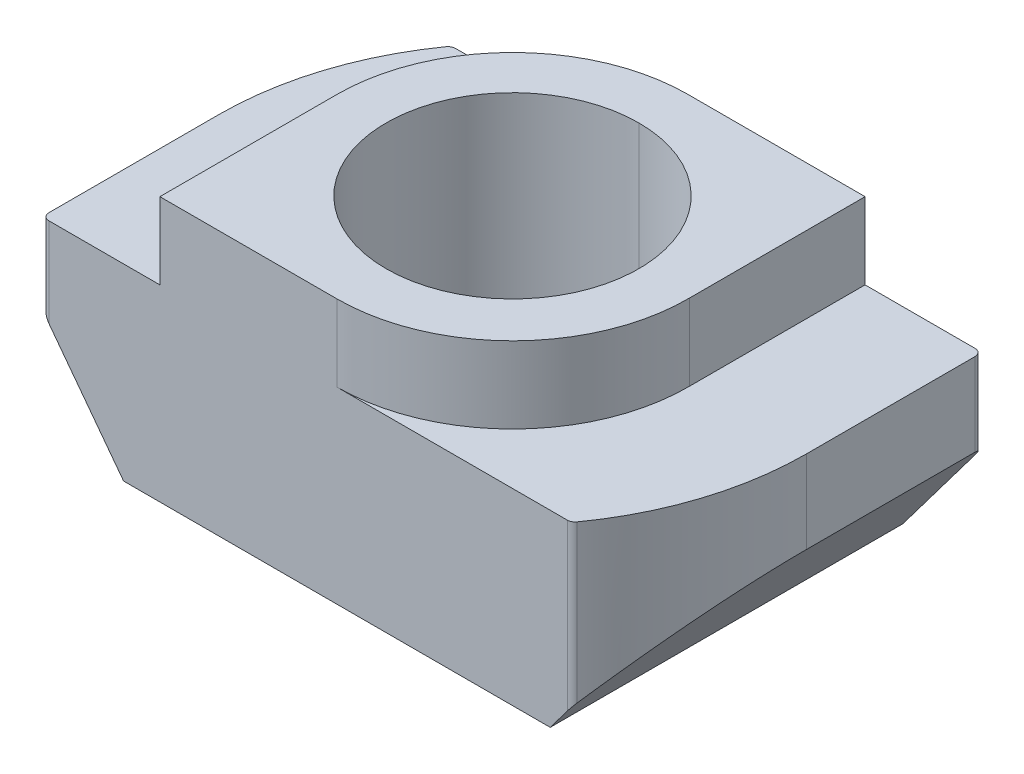
ISO-10303-21;
HEADER;
FILE_DESCRIPTION(('STEP AP214'),'2;1');
FILE_NAME('part.step','',(''),(''),'','','');
FILE_SCHEMA(('AUTOMOTIVE_DESIGN { 1 0 10303 214 1 1 1 1 }'));
ENDSEC;
DATA;
#1=APPLICATION_CONTEXT('core data for automotive mechanical design processes');
#2=APPLICATION_PROTOCOL_DEFINITION('international standard','automotive_design',2000,#1);
#3=PRODUCT_CONTEXT('',#1,'mechanical');
#4=PRODUCT('Part','Part','',(#3));
#5=PRODUCT_RELATED_PRODUCT_CATEGORY('part','',(#4));
#6=PRODUCT_DEFINITION_FORMATION('','',#4);
#7=PRODUCT_DEFINITION_CONTEXT('part definition',#1,'design');
#8=PRODUCT_DEFINITION('design','',#6,#7);
#9=PRODUCT_DEFINITION_SHAPE('','',#8);
#10=(LENGTH_UNIT() NAMED_UNIT(*) SI_UNIT(.MILLI.,.METRE.));
#11=(NAMED_UNIT(*) PLANE_ANGLE_UNIT() SI_UNIT($,.RADIAN.));
#12=(NAMED_UNIT(*) SI_UNIT($,.STERADIAN.) SOLID_ANGLE_UNIT());
#13=UNCERTAINTY_MEASURE_WITH_UNIT(LENGTH_MEASURE(1.E-05),#10,'distance_accuracy_value','');
#14=(GEOMETRIC_REPRESENTATION_CONTEXT(3) GLOBAL_UNCERTAINTY_ASSIGNED_CONTEXT((#13)) GLOBAL_UNIT_ASSIGNED_CONTEXT((#10,
#11,#12)) REPRESENTATION_CONTEXT('',''));
#15=CARTESIAN_POINT('',(0.,0.,0.));
#16=DIRECTION('',(0.,0.,1.));
#17=DIRECTION('',(1.,0.,0.));
#18=AXIS2_PLACEMENT_3D('',#15,#16,#17);
#19=CARTESIAN_POINT('',(-0.024551835244514,-0.00100000000000013,0.));
#20=DIRECTION('',(0.,1.,0.));
#21=DIRECTION('',(0.,0.,1.));
#22=AXIS2_PLACEMENT_3D('',#19,#20,#21);
#23=CYLINDRICAL_SURFACE('',#22,2.15);
#24=DIRECTION('',(0.,1.,0.));
#25=VECTOR('',#24,1.);
#26=CARTESIAN_POINT('',(-0.0245518352445138,-0.00100000000000013,-2.15));
#27=LINE('',#26,#25);
#28=CARTESIAN_POINT('',(-0.0245518352445138,0.,-2.15));
#29=VERTEX_POINT('',#28);
#30=CARTESIAN_POINT('',(-0.0245518352445138,4.5,-2.15));
#31=VERTEX_POINT('',#30);
#32=EDGE_CURVE('E527',#29,#31,#27,.T.);
#33=ORIENTED_EDGE('',*,*,#32,.F.);
#34=CARTESIAN_POINT('',(-0.024551835244514,0.,0.));
#35=DIRECTION('',(0.,1.,0.));
#36=DIRECTION('',(0.,0.,-1.));
#37=AXIS2_PLACEMENT_3D('',#34,#35,#36);
#38=CIRCLE('',#37,2.15);
#39=CARTESIAN_POINT('',(-0.024551835244514,0.,2.15));
#40=VERTEX_POINT('',#39);
#41=EDGE_CURVE('E125',#40,#29,#38,.T.);
#42=ORIENTED_EDGE('',*,*,#41,.F.);
#43=DIRECTION('',(0.,1.,0.));
#44=VECTOR('',#43,1.);
#45=CARTESIAN_POINT('',(-0.024551835244514,-0.00100000000000013,2.15));
#46=LINE('',#45,#44);
#47=CARTESIAN_POINT('',(-0.024551835244514,4.5,2.15));
#48=VERTEX_POINT('',#47);
#49=EDGE_CURVE('E470',#40,#48,#46,.T.);
#50=ORIENTED_EDGE('',*,*,#49,.T.);
#51=CARTESIAN_POINT('',(-0.024551835244514,4.5,0.));
#52=DIRECTION('',(0.,1.,0.));
#53=DIRECTION('',(0.,0.,1.));
#54=AXIS2_PLACEMENT_3D('',#51,#52,#53);
#55=CIRCLE('',#54,2.15);
#56=EDGE_CURVE('E9',#48,#31,#55,.T.);
#57=ORIENTED_EDGE('',*,*,#56,.T.);
#58=EDGE_LOOP('',(#33,#42,#50,#57));
#59=FACE_BOUND('',#58,.T.);
#60=ADVANCED_FACE('F15',(#59),#23,.F.);
#61=CARTESIAN_POINT('',(3.63,0.,-4.65));
#62=DIRECTION('',(-0.79863551004729,0.601815023152053,0.));
#63=DIRECTION('',(0.,0.,1.));
#64=AXIS2_PLACEMENT_3D('',#61,#62,#63);
#65=PLANE('',#64);
#66=DIRECTION('',(0.,0.,-1.));
#67=VECTOR('',#66,1.);
#68=CARTESIAN_POINT('',(3.63,0.,-2.85267364326446));
#69=LINE('',#68,#67);
#70=CARTESIAN_POINT('',(3.63,0.,3.01232635673554));
#71=VERTEX_POINT('',#70);
#72=CARTESIAN_POINT('',(3.63,0.,-2.98767364326446));
#73=VERTEX_POINT('',#72);
#74=EDGE_CURVE('E272',#71,#73,#69,.T.);
#75=ORIENTED_EDGE('',*,*,#74,.T.);
#76=DIRECTION('',(-0.601815023152053,-0.79863551004729,0.));
#77=VECTOR('',#76,1.);
#78=CARTESIAN_POINT('',(5.61330473915061,2.63193428378501,-2.98767364326446));
#79=LINE('',#78,#77);
#80=CARTESIAN_POINT('',(4.85945607210742,1.63154331389991,-2.98767364326446));
#81=VERTEX_POINT('',#80);
#82=EDGE_CURVE('E498',#81,#73,#79,.T.);
#83=ORIENTED_EDGE('',*,*,#82,.F.);
#84=CARTESIAN_POINT('',(4.97945607210742,1.79078869249436,-2.86767364326445));
#85=CARTESIAN_POINT('',(4.97945607210742,1.79078869249435,-2.93796801577968));
#86=CARTESIAN_POINT('',(4.92975044462265,1.72482709693529,-2.98767364326445));
#87=CARTESIAN_POINT('',(4.85945607210742,1.63154331389991,-2.98767364326446));
#88=(BOUNDED_CURVE() B_SPLINE_CURVE(3,(#84,#85,#86,#87),.UNSPECIFIED.,.F.,
.F.) B_SPLINE_CURVE_WITH_KNOTS((4,4),(3.14159265358979,4.7123889803847),
.UNSPECIFIED.) CURVE() GEOMETRIC_REPRESENTATION_ITEM() RATIONAL_B_SPLINE_CURVE((1.,
0.804737854124362,0.804737854124362,1.)) REPRESENTATION_ITEM(''));
#89=CARTESIAN_POINT('',(4.97945607210742,1.79078869249436,-2.86767364326445));
#90=VERTEX_POINT('',#89);
#91=EDGE_CURVE('E499',#90,#81,#88,.T.);
#92=ORIENTED_EDGE('',*,*,#91,.F.);
#93=DIRECTION('',(0.,0.,-1.));
#94=VECTOR('',#93,1.);
#95=CARTESIAN_POINT('',(4.97945607210742,1.79078869249435,0.));
#96=LINE('',#95,#94);
#97=CARTESIAN_POINT('',(4.97945607210742,1.79078869249435,0.));
#98=VERTEX_POINT('',#97);
#99=EDGE_CURVE('E447',#98,#90,#96,.T.);
#100=ORIENTED_EDGE('',*,*,#99,.F.);
#101=CARTESIAN_POINT('',(4.02973652434524,0.530468284644888,2.9559577450269));
#102=CARTESIAN_POINT('',(4.65243275016336,1.35681408655938,2.08693430503643));
#103=CARTESIAN_POINT('',(4.97945607210742,1.79078869249435,1.06908948591827));
#104=CARTESIAN_POINT('',(4.97945607210742,1.79078869249435,0.));
#105=(BOUNDED_CURVE() B_SPLINE_CURVE(3,(#101,#102,#103,#104),.UNSPECIFIED.,.F.,
.F.) B_SPLINE_CURVE_WITH_KNOTS((4,4),(2.51984736449592,3.1415926535898),
.UNSPECIFIED.) CURVE() GEOMETRIC_REPRESENTATION_ITEM() RATIONAL_B_SPLINE_CURVE((1.,
0.968044666372586,0.968044666372586,1.)) REPRESENTATION_ITEM(''));
#106=CARTESIAN_POINT('',(4.02973652434524,0.530468284644888,2.9559577450269));
#107=VERTEX_POINT('',#106);
#108=EDGE_CURVE('E271',#107,#98,#105,.T.);
#109=ORIENTED_EDGE('',*,*,#108,.F.);
#110=CARTESIAN_POINT('',(3.92,0.384842998269915,3.01232635673554));
#111=CARTESIAN_POINT('',(3.96439243811548,0.443753753390169,3.01232635673554));
#112=CARTESIAN_POINT('',(4.0038799388737,0.496155436790089,2.99204272181212));
#113=CARTESIAN_POINT('',(4.02973652434524,0.530468284644888,2.9559577450269));
#114=(BOUNDED_CURVE() B_SPLINE_CURVE(3,(#110,#111,#112,#113),.UNSPECIFIED.,.F.,
.F.) B_SPLINE_CURVE_WITH_KNOTS((4,4),(1.5707963267949,2.51984736449592),
.UNSPECIFIED.) CURVE() GEOMETRIC_REPRESENTATION_ITEM() RATIONAL_B_SPLINE_CURVE((1.,
0.926339746655243,0.926339746655243,1.)) REPRESENTATION_ITEM(''));
#115=CARTESIAN_POINT('',(3.92,0.384842998269915,3.01232635673554));
#116=VERTEX_POINT('',#115);
#117=EDGE_CURVE('E238',#116,#107,#114,.T.);
#118=ORIENTED_EDGE('',*,*,#117,.F.);
#119=DIRECTION('',(0.601815023152053,0.79863551004729,0.));
#120=VECTOR('',#119,1.);
#121=CARTESIAN_POINT('',(5.27305129690785,2.18040271521824,3.01232635673554));
#122=LINE('',#121,#120);
#123=EDGE_CURVE('E506',#71,#116,#122,.T.);
#124=ORIENTED_EDGE('',*,*,#123,.F.);
#125=EDGE_LOOP('',(#75,#83,#92,#100,#109,#118,#124));
#126=FACE_BOUND('',#125,.T.);
#127=ADVANCED_FACE('F17',(#126),#65,.F.);
#128=CARTESIAN_POINT('',(-3.63,0.,-4.65));
#129=DIRECTION('',(0.79863551004729,0.601815023152053,0.));
#130=DIRECTION('',(0.,0.,-1.));
#131=AXIS2_PLACEMENT_3D('',#128,#129,#130);
#132=PLANE('',#131);
#133=DIRECTION('',(0.,0.,1.));
#134=VECTOR('',#133,1.);
#135=CARTESIAN_POINT('',(-5.02054392789258,1.84531411874553,-4.65));
#136=LINE('',#135,#134);
#137=CARTESIAN_POINT('',(-5.02054392789258,1.84531411874553,0.));
#138=VERTEX_POINT('',#137);
#139=CARTESIAN_POINT('',(-5.02054392789258,1.84531411874553,2.89232635673554));
#140=VERTEX_POINT('',#139);
#141=EDGE_CURVE('E261',#138,#140,#136,.T.);
#142=ORIENTED_EDGE('',*,*,#141,.F.);
#143=CARTESIAN_POINT('',(-4.08885480736663,0.608920895991516,-2.930631323799));
#144=CARTESIAN_POINT('',(-4.69993502645744,1.41985173633062,-2.06668938083629));
#145=CARTESIAN_POINT('',(-5.02054392789258,1.84531411874553,-1.05821298185869));
#146=CARTESIAN_POINT('',(-5.02054392789258,1.84531411874553,0.));
#147=(BOUNDED_CURVE() B_SPLINE_CURVE(3,(#143,#144,#145,#146),.UNSPECIFIED.,.F.,
.F.) B_SPLINE_CURVE_WITH_KNOTS((4,4),(2.52597327905867,3.1415926535898),
.UNSPECIFIED.) CURVE() GEOMETRIC_REPRESENTATION_ITEM() RATIONAL_B_SPLINE_CURVE((1.,
0.968666305848477,0.968666305848477,1.)) REPRESENTATION_ITEM(''));
#148=CARTESIAN_POINT('',(-4.08885480736663,0.608920895991516,-2.930631323799));
#149=VERTEX_POINT('',#148);
#150=EDGE_CURVE('E484',#149,#138,#147,.T.);
#151=ORIENTED_EDGE('',*,*,#150,.F.);
#152=CARTESIAN_POINT('',(-3.97863865589294,0.462659122919423,-2.98767364326446));
#153=CARTESIAN_POINT('',(-4.02334074952601,0.52198080479078,-2.98767364326445));
#154=CARTESIAN_POINT('',(-4.06304094414684,0.574664742479666,-2.96712682545126));
#155=CARTESIAN_POINT('',(-4.08885480736663,0.608920895991516,-2.930631323799));
#156=(BOUNDED_CURVE() B_SPLINE_CURVE(3,(#152,#153,#154,#155),.UNSPECIFIED.,.F.,
.F.) B_SPLINE_CURVE_WITH_KNOTS((4,4),(1.5707963267949,2.52597327905868),
.UNSPECIFIED.) CURVE() GEOMETRIC_REPRESENTATION_ITEM() RATIONAL_B_SPLINE_CURVE((1.,
0.925403956045779,0.925403956045779,1.)) REPRESENTATION_ITEM(''));
#157=CARTESIAN_POINT('',(-3.97863865589294,0.462659122919423,-2.98767364326446));
#158=VERTEX_POINT('',#157);
#159=EDGE_CURVE('E290',#158,#149,#156,.T.);
#160=ORIENTED_EDGE('',*,*,#159,.F.);
#161=DIRECTION('',(-0.601815023152053,0.79863551004729,0.));
#162=VECTOR('',#161,1.);
#163=CARTESIAN_POINT('',(-2.09329628946769,-2.03927470142675,-2.98767364326446));
#164=LINE('',#163,#162);
#165=CARTESIAN_POINT('',(-3.63,0.,-2.98767364326446));
#166=VERTEX_POINT('',#165);
#167=EDGE_CURVE('E520',#166,#158,#164,.T.);
#168=ORIENTED_EDGE('',*,*,#167,.F.);
#169=DIRECTION('',(0.,0.,1.));
#170=VECTOR('',#169,1.);
#171=CARTESIAN_POINT('',(-3.63,0.,-2.85267364326446));
#172=LINE('',#171,#170);
#173=CARTESIAN_POINT('',(-3.63,0.,3.01232635673554));
#174=VERTEX_POINT('',#173);
#175=EDGE_CURVE('E233',#166,#174,#172,.T.);
#176=ORIENTED_EDGE('',*,*,#175,.T.);
#177=DIRECTION('',(0.601815023152053,-0.79863551004729,0.));
#178=VECTOR('',#177,1.);
#179=CARTESIAN_POINT('',(-2.43354973171045,-1.58774313285998,3.01232635673554));
#180=LINE('',#179,#178);
#181=CARTESIAN_POINT('',(-4.90054392789258,1.68606874015109,3.01232635673554));
#182=VERTEX_POINT('',#181);
#183=EDGE_CURVE('E229',#182,#174,#180,.T.);
#184=ORIENTED_EDGE('',*,*,#183,.F.);
#185=CARTESIAN_POINT('',(-5.02054392789258,1.84531411874553,2.89232635673554));
#186=CARTESIAN_POINT('',(-5.02054392789258,1.84531411874553,2.96262072925078));
#187=CARTESIAN_POINT('',(-4.97083830040781,1.77935252318647,3.01232635673555));
#188=CARTESIAN_POINT('',(-4.90054392789258,1.68606874015109,3.01232635673554));
#189=(BOUNDED_CURVE() B_SPLINE_CURVE(3,(#185,#186,#187,#188),.UNSPECIFIED.,.F.,
.F.) B_SPLINE_CURVE_WITH_KNOTS((4,4),(3.1415926535898,4.71238898038469),
.UNSPECIFIED.) CURVE() GEOMETRIC_REPRESENTATION_ITEM() RATIONAL_B_SPLINE_CURVE((1.,
0.804737854124365,0.804737854124365,1.)) REPRESENTATION_ITEM(''));
#190=EDGE_CURVE('E224',#140,#182,#189,.T.);
#191=ORIENTED_EDGE('',*,*,#190,.F.);
#192=EDGE_LOOP('',(#142,#151,#160,#168,#176,#184,#191));
#193=FACE_BOUND('',#192,.T.);
#194=ADVANCED_FACE('F231',(#193),#132,.F.);
#195=CARTESIAN_POINT('',(0.,4.5,0.0245518352445135));
#196=DIRECTION('',(0.,1.,0.));
#197=DIRECTION('',(1.,0.,0.));
#198=AXIS2_PLACEMENT_3D('',#195,#196,#197);
#199=PLANE('',#198);
#200=ORIENTED_EDGE('',*,*,#56,.F.);
#201=CARTESIAN_POINT('',(-0.024551835244514,4.5,0.));
#202=DIRECTION('',(0.,1.,0.));
#203=DIRECTION('',(0.,0.,1.));
#204=AXIS2_PLACEMENT_3D('',#201,#202,#203);
#205=CIRCLE('',#204,2.15);
#206=EDGE_CURVE('E523',#31,#48,#205,.T.);
#207=ORIENTED_EDGE('',*,*,#206,.F.);
#208=EDGE_LOOP('',(#200,#207));
#209=FACE_BOUND('',#208,.T.);
#210=CARTESIAN_POINT('',(0.,4.5,0.0245518352445135));
#211=DIRECTION('',(0.,1.,0.));
#212=DIRECTION('',(0.,0.,1.));
#213=AXIS2_PLACEMENT_3D('',#210,#211,#212);
#214=CIRCLE('',#213,2.98777452149104);
#215=CARTESIAN_POINT('',(0.,4.5,3.01232635673554));
#216=VERTEX_POINT('',#215);
#217=CARTESIAN_POINT('',(2.98767364326446,4.5,0.));
#218=VERTEX_POINT('',#217);
#219=EDGE_CURVE('E608',#216,#218,#214,.T.);
#220=ORIENTED_EDGE('',*,*,#219,.T.);
#221=DIRECTION('',(0.,0.,-1.));
#222=VECTOR('',#221,1.);
#223=CARTESIAN_POINT('',(2.98767364326446,4.5,0.));
#224=LINE('',#223,#222);
#225=CARTESIAN_POINT('',(2.98767364326446,4.5,-2.98767364326446));
#226=VERTEX_POINT('',#225);
#227=EDGE_CURVE('E41',#218,#226,#224,.T.);
#228=ORIENTED_EDGE('',*,*,#227,.T.);
#229=DIRECTION('',(-1.,0.,0.));
#230=VECTOR('',#229,1.);
#231=CARTESIAN_POINT('',(2.98767364326446,4.5,-2.98767364326446));
#232=LINE('',#231,#230);
#233=CARTESIAN_POINT('',(0.,4.5,-2.98767364326446));
#234=VERTEX_POINT('',#233);
#235=EDGE_CURVE('E577',#226,#234,#232,.T.);
#236=ORIENTED_EDGE('',*,*,#235,.T.);
#237=CARTESIAN_POINT('',(-0.024551835244514,4.5,0.));
#238=DIRECTION('',(0.,1.,0.));
#239=DIRECTION('',(0.,0.,-1.));
#240=AXIS2_PLACEMENT_3D('',#237,#238,#239);
#241=CIRCLE('',#240,2.98777452149103);
#242=CARTESIAN_POINT('',(-0.024551835244514,4.5,-2.98777452149103));
#243=VERTEX_POINT('',#242);
#244=EDGE_CURVE('E303',#234,#243,#241,.T.);
#245=ORIENTED_EDGE('',*,*,#244,.T.);
#246=CARTESIAN_POINT('',(-0.024551835244514,4.5,0.));
#247=DIRECTION('',(0.,1.,0.));
#248=DIRECTION('',(0.,0.,-1.));
#249=AXIS2_PLACEMENT_3D('',#246,#247,#248);
#250=CIRCLE('',#249,2.98777452149103);
#251=CARTESIAN_POINT('',(-3.01232635673554,4.5,0.));
#252=VERTEX_POINT('',#251);
#253=EDGE_CURVE('E309',#243,#252,#250,.T.);
#254=ORIENTED_EDGE('',*,*,#253,.T.);
#255=DIRECTION('',(0.,0.,1.));
#256=VECTOR('',#255,1.);
#257=CARTESIAN_POINT('',(-3.01232635673554,4.5,3.01232635673555));
#258=LINE('',#257,#256);
#259=CARTESIAN_POINT('',(-3.01232635673554,4.5,3.01232635673555));
#260=VERTEX_POINT('',#259);
#261=EDGE_CURVE('E26',#252,#260,#258,.T.);
#262=ORIENTED_EDGE('',*,*,#261,.T.);
#263=DIRECTION('',(1.,0.,0.));
#264=VECTOR('',#263,1.);
#265=CARTESIAN_POINT('',(0.,4.5,3.01232635673554));
#266=LINE('',#265,#264);
#267=EDGE_CURVE('E576',#260,#216,#266,.T.);
#268=ORIENTED_EDGE('',*,*,#267,.T.);
#269=EDGE_LOOP('',(#220,#228,#236,#245,#254,#262,#268));
#270=FACE_BOUND('',#269,.T.);
#271=ADVANCED_FACE('F337',(#209,#270),#199,.T.);
#272=CARTESIAN_POINT('',(-3.01232635673554,4.5,3.01232635673555));
#273=DIRECTION('',(1.,0.,0.));
#274=DIRECTION('',(0.,1.,0.));
#275=AXIS2_PLACEMENT_3D('',#272,#273,#274);
#276=PLANE('',#275);
#277=DIRECTION('',(0.,0.,1.));
#278=VECTOR('',#277,1.);
#279=CARTESIAN_POINT('',(-3.01232635673554,3.2,3.01232635673555));
#280=LINE('',#279,#278);
#281=CARTESIAN_POINT('',(-3.01232635673554,3.2,0.));
#282=VERTEX_POINT('',#281);
#283=CARTESIAN_POINT('',(-3.01232635673554,3.2,3.01232635673554));
#284=VERTEX_POINT('',#283);
#285=EDGE_CURVE('E395',#282,#284,#280,.T.);
#286=ORIENTED_EDGE('',*,*,#285,.T.);
#287=DIRECTION('',(0.,-1.,0.));
#288=VECTOR('',#287,1.);
#289=CARTESIAN_POINT('',(-3.01232635673554,4.5,3.01232635673555));
#290=LINE('',#289,#288);
#291=EDGE_CURVE('E239',#260,#284,#290,.T.);
#292=ORIENTED_EDGE('',*,*,#291,.F.);
#293=ORIENTED_EDGE('',*,*,#261,.F.);
#294=DIRECTION('',(0.,-1.,0.));
#295=VECTOR('',#294,1.);
#296=CARTESIAN_POINT('',(-3.01232635673554,4.5,0.));
#297=LINE('',#296,#295);
#298=EDGE_CURVE('E400',#252,#282,#297,.T.);
#299=ORIENTED_EDGE('',*,*,#298,.T.);
#300=EDGE_LOOP('',(#286,#292,#293,#299));
#301=FACE_BOUND('',#300,.T.);
#302=ADVANCED_FACE('F335',(#301),#276,.F.);
#303=CARTESIAN_POINT('',(-0.024551835244514,4.5,0.));
#304=DIRECTION('',(0.,-1.,0.));
#305=DIRECTION('',(0.,0.,-1.));
#306=AXIS2_PLACEMENT_3D('',#303,#304,#305);
#307=CYLINDRICAL_SURFACE('',#306,2.98777452149103);
#308=DIRECTION('',(0.,-1.,0.));
#309=VECTOR('',#308,1.);
#310=CARTESIAN_POINT('',(-0.024551835244514,4.5,-2.98777452149103));
#311=LINE('',#310,#309);
#312=CARTESIAN_POINT('',(-0.0245518352445137,3.2,-2.98772408237775));
#313=VERTEX_POINT('',#312);
#314=EDGE_CURVE('E304',#243,#313,#311,.T.);
#315=ORIENTED_EDGE('',*,*,#314,.F.);
#316=ORIENTED_EDGE('',*,*,#244,.F.);
#317=DIRECTION('',(0.,-1.,0.));
#318=VECTOR('',#317,1.);
#319=CARTESIAN_POINT('',(0.,4.5,-2.98767364326446));
#320=LINE('',#319,#318);
#321=CARTESIAN_POINT('',(0.,3.2,-2.98767364326446));
#322=VERTEX_POINT('',#321);
#323=EDGE_CURVE('E581',#234,#322,#320,.T.);
#324=ORIENTED_EDGE('',*,*,#323,.T.);
#325=CARTESIAN_POINT('',(-0.024551835244514,3.2,0.));
#326=DIRECTION('',(0.,1.,0.));
#327=DIRECTION('',(0.00821743242933786,0.,-0.999966236332142));
#328=AXIS2_PLACEMENT_3D('',#325,#326,#327);
#329=CIRCLE('',#328,2.98777452149103);
#330=EDGE_CURVE('E317',#322,#313,#329,.T.);
#331=ORIENTED_EDGE('',*,*,#330,.T.);
#332=EDGE_LOOP('',(#315,#316,#324,#331));
#333=FACE_BOUND('',#332,.T.);
#334=ADVANCED_FACE('F324',(#333),#307,.T.);
#335=CARTESIAN_POINT('',(2.98767364326446,4.5,0.));
#336=DIRECTION('',(-1.,0.,0.));
#337=DIRECTION('',(0.,0.,1.));
#338=AXIS2_PLACEMENT_3D('',#335,#336,#337);
#339=PLANE('',#338);
#340=DIRECTION('',(0.,0.,-1.));
#341=VECTOR('',#340,1.);
#342=CARTESIAN_POINT('',(2.98767364326446,3.2,0.));
#343=LINE('',#342,#341);
#344=CARTESIAN_POINT('',(2.98767364326446,3.2,0.));
#345=VERTEX_POINT('',#344);
#346=CARTESIAN_POINT('',(2.98767364326446,3.2,-2.98767364326446));
#347=VERTEX_POINT('',#346);
#348=EDGE_CURVE('E474',#345,#347,#343,.T.);
#349=ORIENTED_EDGE('',*,*,#348,.T.);
#350=DIRECTION('',(0.,-1.,0.));
#351=VECTOR('',#350,1.);
#352=CARTESIAN_POINT('',(2.98767364326446,4.5,-2.98767364326446));
#353=LINE('',#352,#351);
#354=EDGE_CURVE('E275',#226,#347,#353,.T.);
#355=ORIENTED_EDGE('',*,*,#354,.F.);
#356=ORIENTED_EDGE('',*,*,#227,.F.);
#357=DIRECTION('',(0.,-1.,0.));
#358=VECTOR('',#357,1.);
#359=CARTESIAN_POINT('',(2.98767364326446,4.5,0.));
#360=LINE('',#359,#358);
#361=EDGE_CURVE('E610',#218,#345,#360,.T.);
#362=ORIENTED_EDGE('',*,*,#361,.T.);
#363=EDGE_LOOP('',(#349,#355,#356,#362));
#364=FACE_BOUND('',#363,.T.);
#365=ADVANCED_FACE('F334',(#364),#339,.F.);
#366=CARTESIAN_POINT('',(0.,4.5,0.0245518352445135));
#367=DIRECTION('',(0.,-1.,0.));
#368=DIRECTION('',(0.,0.,-1.));
#369=AXIS2_PLACEMENT_3D('',#366,#367,#368);
#370=CYLINDRICAL_SURFACE('',#369,2.98777452149104);
#371=CARTESIAN_POINT('',(0.,3.2,0.0245518352445135));
#372=DIRECTION('',(0.,1.,0.));
#373=DIRECTION('',(0.,0.,1.));
#374=AXIS2_PLACEMENT_3D('',#371,#372,#373);
#375=CIRCLE('',#374,2.98777452149104);
#376=CARTESIAN_POINT('',(0.,3.2,3.01232635673554));
#377=VERTEX_POINT('',#376);
#378=EDGE_CURVE('E530',#377,#345,#375,.T.);
#379=ORIENTED_EDGE('',*,*,#378,.T.);
#380=ORIENTED_EDGE('',*,*,#361,.F.);
#381=ORIENTED_EDGE('',*,*,#219,.F.);
#382=DIRECTION('',(0.,-1.,0.));
#383=VECTOR('',#382,1.);
#384=CARTESIAN_POINT('',(0.,4.5,3.01232635673554));
#385=LINE('',#384,#383);
#386=EDGE_CURVE('E573',#216,#377,#385,.T.);
#387=ORIENTED_EDGE('',*,*,#386,.T.);
#388=EDGE_LOOP('',(#379,#380,#381,#387));
#389=FACE_BOUND('',#388,.T.);
#390=ADVANCED_FACE('F350',(#389),#370,.T.);
#391=CARTESIAN_POINT('',(-3.97863865589294,0.,-2.85267364326446));
#392=DIRECTION('',(0.,-1.,0.));
#393=DIRECTION('',(0.,0.,-1.));
#394=AXIS2_PLACEMENT_3D('',#391,#392,#393);
#395=PLANE('',#394);
#396=ORIENTED_EDGE('',*,*,#41,.T.);
#397=CARTESIAN_POINT('',(-0.024551835244514,0.,0.));
#398=DIRECTION('',(0.,1.,0.));
#399=DIRECTION('',(0.,0.,-1.));
#400=AXIS2_PLACEMENT_3D('',#397,#398,#399);
#401=CIRCLE('',#400,2.15);
#402=EDGE_CURVE('E540',#29,#40,#401,.T.);
#403=ORIENTED_EDGE('',*,*,#402,.T.);
#404=EDGE_LOOP('',(#396,#403));
#405=FACE_BOUND('',#404,.T.);
#406=ORIENTED_EDGE('',*,*,#74,.F.);
#407=DIRECTION('',(1.,0.,0.));
#408=VECTOR('',#407,1.);
#409=CARTESIAN_POINT('',(3.92,0.,3.01232635673554));
#410=LINE('',#409,#408);
#411=EDGE_CURVE('E250',#174,#71,#410,.T.);
#412=ORIENTED_EDGE('',*,*,#411,.F.);
#413=ORIENTED_EDGE('',*,*,#175,.F.);
#414=DIRECTION('',(-1.,0.,0.));
#415=VECTOR('',#414,1.);
#416=CARTESIAN_POINT('',(4.85945607210742,0.,-2.98767364326446));
#417=LINE('',#416,#415);
#418=EDGE_CURVE('E516',#73,#166,#417,.T.);
#419=ORIENTED_EDGE('',*,*,#418,.F.);
#420=EDGE_LOOP('',(#406,#412,#413,#419));
#421=FACE_BOUND('',#420,.T.);
#422=ADVANCED_FACE('F353',(#405,#421),#395,.T.);
#423=CARTESIAN_POINT('',(4.85945607210742,3.2,-2.98767364326446));
#424=DIRECTION('',(0.,0.,1.));
#425=DIRECTION('',(1.,0.,0.));
#426=AXIS2_PLACEMENT_3D('',#423,#424,#425);
#427=PLANE('',#426);
#428=DIRECTION('',(0.,-1.,0.));
#429=VECTOR('',#428,1.);
#430=CARTESIAN_POINT('',(4.85945607210742,3.2,-2.98767364326446));
#431=LINE('',#430,#429);
#432=CARTESIAN_POINT('',(4.85945607210742,3.2,-2.98767364326446));
#433=VERTEX_POINT('',#432);
#434=EDGE_CURVE('E491',#433,#81,#431,.T.);
#435=ORIENTED_EDGE('',*,*,#434,.T.);
#436=ORIENTED_EDGE('',*,*,#82,.T.);
#437=ORIENTED_EDGE('',*,*,#418,.T.);
#438=ORIENTED_EDGE('',*,*,#167,.T.);
#439=DIRECTION('',(0.,-1.,0.));
#440=VECTOR('',#439,1.);
#441=CARTESIAN_POINT('',(-3.97863865589294,3.2,-2.98767364326446));
#442=LINE('',#441,#440);
#443=CARTESIAN_POINT('',(-3.97863865589294,3.2,-2.98767364326446));
#444=VERTEX_POINT('',#443);
#445=EDGE_CURVE('E297',#444,#158,#442,.T.);
#446=ORIENTED_EDGE('',*,*,#445,.F.);
#447=DIRECTION('',(-1.,0.,0.));
#448=VECTOR('',#447,1.);
#449=CARTESIAN_POINT('',(4.85945607210742,3.2,-2.98767364326446));
#450=LINE('',#449,#448);
#451=CARTESIAN_POINT('',(-0.0491036704889641,3.2,-2.98767364326446));
#452=VERTEX_POINT('',#451);
#453=EDGE_CURVE('E289',#452,#444,#450,.T.);
#454=ORIENTED_EDGE('',*,*,#453,.F.);
#455=CARTESIAN_POINT('',(-0.024551835244514,3.2,0.));
#456=DIRECTION('',(0.,1.,0.));
#457=DIRECTION('',(0.,0.,-1.));
#458=AXIS2_PLACEMENT_3D('',#455,#456,#457);
#459=CIRCLE('',#458,2.98777452149103);
#460=EDGE_CURVE('E308',#313,#452,#459,.T.);
#461=ORIENTED_EDGE('',*,*,#460,.F.);
#462=ORIENTED_EDGE('',*,*,#330,.F.);
#463=ORIENTED_EDGE('',*,*,#323,.F.);
#464=ORIENTED_EDGE('',*,*,#235,.F.);
#465=ORIENTED_EDGE('',*,*,#354,.T.);
#466=DIRECTION('',(-1.,0.,0.));
#467=VECTOR('',#466,1.);
#468=CARTESIAN_POINT('',(4.85945607210742,3.2,-2.98767364326446));
#469=LINE('',#468,#467);
#470=EDGE_CURVE('E280',#433,#347,#469,.T.);
#471=ORIENTED_EDGE('',*,*,#470,.F.);
#472=EDGE_LOOP('',(#435,#436,#437,#438,#446,#454,#461,#462,#463,#464,#465,#471));
#473=FACE_BOUND('',#472,.T.);
#474=ADVANCED_FACE('F371',(#473),#427,.F.);
#475=CARTESIAN_POINT('',(4.85945607210742,3.2,-2.86767364326445));
#476=DIRECTION('',(0.,-1.,0.));
#477=DIRECTION('',(0.,0.,-1.));
#478=AXIS2_PLACEMENT_3D('',#475,#476,#477);
#479=CYLINDRICAL_SURFACE('',#478,0.12);
#480=DIRECTION('',(0.,-1.,0.));
#481=VECTOR('',#480,1.);
#482=CARTESIAN_POINT('',(4.97945607210742,3.2,-2.86767364326445));
#483=LINE('',#482,#481);
#484=CARTESIAN_POINT('',(4.97945607210742,3.2,-2.86767364326445));
#485=VERTEX_POINT('',#484);
#486=EDGE_CURVE('E505',#485,#90,#483,.T.);
#487=ORIENTED_EDGE('',*,*,#486,.T.);
#488=ORIENTED_EDGE('',*,*,#91,.T.);
#489=ORIENTED_EDGE('',*,*,#434,.F.);
#490=CARTESIAN_POINT('',(4.85945607210742,3.2,-2.86767364326445));
#491=DIRECTION('',(0.,1.,0.));
#492=DIRECTION('',(0.,0.,1.));
#493=AXIS2_PLACEMENT_3D('',#490,#491,#492);
#494=CIRCLE('',#493,0.12);
#495=EDGE_CURVE('E276',#485,#433,#494,.T.);
#496=ORIENTED_EDGE('',*,*,#495,.F.);
#497=EDGE_LOOP('',(#487,#488,#489,#496));
#498=FACE_BOUND('',#497,.T.);
#499=ADVANCED_FACE('F375',(#498),#479,.T.);
#500=CARTESIAN_POINT('',(4.97945607210742,3.2,0.));
#501=DIRECTION('',(-1.,0.,0.));
#502=DIRECTION('',(0.,0.,1.));
#503=AXIS2_PLACEMENT_3D('',#500,#501,#502);
#504=PLANE('',#503);
#505=DIRECTION('',(0.,-1.,0.));
#506=VECTOR('',#505,1.);
#507=CARTESIAN_POINT('',(4.97945607210742,3.2,0.));
#508=LINE('',#507,#506);
#509=CARTESIAN_POINT('',(4.97945607210742,3.2,0.));
#510=VERTEX_POINT('',#509);
#511=EDGE_CURVE('E214',#510,#98,#508,.T.);
#512=ORIENTED_EDGE('',*,*,#511,.T.);
#513=ORIENTED_EDGE('',*,*,#99,.T.);
#514=ORIENTED_EDGE('',*,*,#486,.F.);
#515=DIRECTION('',(0.,0.,-1.));
#516=VECTOR('',#515,1.);
#517=CARTESIAN_POINT('',(4.97945607210742,3.2,0.));
#518=LINE('',#517,#516);
#519=EDGE_CURVE('E281',#510,#485,#518,.T.);
#520=ORIENTED_EDGE('',*,*,#519,.F.);
#521=EDGE_LOOP('',(#512,#513,#514,#520));
#522=FACE_BOUND('',#521,.T.);
#523=ADVANCED_FACE('F437',(#522),#504,.F.);
#524=CARTESIAN_POINT('',(-0.0955439278925783,3.2,0.));
#525=DIRECTION('',(0.,-1.,0.));
#526=DIRECTION('',(0.,0.,-1.));
#527=AXIS2_PLACEMENT_3D('',#524,#525,#526);
#528=CYLINDRICAL_SURFACE('',#527,5.075);
#529=DIRECTION('',(0.,-1.,0.));
#530=VECTOR('',#529,1.);
#531=CARTESIAN_POINT('',(4.02973652434524,3.2,2.9559577450269));
#532=LINE('',#531,#530);
#533=CARTESIAN_POINT('',(4.02973652434524,3.2,2.9559577450269));
#534=VERTEX_POINT('',#533);
#535=EDGE_CURVE('E202',#534,#107,#532,.T.);
#536=ORIENTED_EDGE('',*,*,#535,.T.);
#537=ORIENTED_EDGE('',*,*,#108,.T.);
#538=ORIENTED_EDGE('',*,*,#511,.F.);
#539=CARTESIAN_POINT('',(-0.0955439278925783,3.2,0.));
#540=DIRECTION('',(0.,1.,0.));
#541=DIRECTION('',(0.,0.,1.));
#542=AXIS2_PLACEMENT_3D('',#539,#540,#541);
#543=CIRCLE('',#542,5.075);
#544=EDGE_CURVE('E482',#534,#510,#543,.T.);
#545=ORIENTED_EDGE('',*,*,#544,.F.);
#546=EDGE_LOOP('',(#536,#537,#538,#545));
#547=FACE_BOUND('',#546,.T.);
#548=ADVANCED_FACE('F435',(#547),#528,.T.);
#549=CARTESIAN_POINT('',(3.92,3.2,2.87732635673554));
#550=DIRECTION('',(0.,-1.,0.));
#551=DIRECTION('',(0.,0.,-1.));
#552=AXIS2_PLACEMENT_3D('',#549,#550,#551);
#553=CYLINDRICAL_SURFACE('',#552,0.135);
#554=DIRECTION('',(0.,-1.,0.));
#555=VECTOR('',#554,1.);
#556=CARTESIAN_POINT('',(3.92,3.2,3.01232635673554));
#557=LINE('',#556,#555);
#558=CARTESIAN_POINT('',(3.92,3.2,3.01232635673554));
#559=VERTEX_POINT('',#558);
#560=EDGE_CURVE('E513',#559,#116,#557,.T.);
#561=ORIENTED_EDGE('',*,*,#560,.T.);
#562=ORIENTED_EDGE('',*,*,#117,.T.);
#563=ORIENTED_EDGE('',*,*,#535,.F.);
#564=CARTESIAN_POINT('',(3.92,3.2,2.87732635673554));
#565=DIRECTION('',(0.,1.,0.));
#566=DIRECTION('',(0.,0.,-1.));
#567=AXIS2_PLACEMENT_3D('',#564,#565,#566);
#568=CIRCLE('',#567,0.135);
#569=EDGE_CURVE('E478',#559,#534,#568,.T.);
#570=ORIENTED_EDGE('',*,*,#569,.F.);
#571=EDGE_LOOP('',(#561,#562,#563,#570));
#572=FACE_BOUND('',#571,.T.);
#573=ADVANCED_FACE('F357',(#572),#553,.T.);
#574=CARTESIAN_POINT('',(3.92,3.2,3.01232635673554));
#575=DIRECTION('',(0.,0.,-1.));
#576=DIRECTION('',(0.,-1.,0.));
#577=AXIS2_PLACEMENT_3D('',#574,#575,#576);
#578=PLANE('',#577);
#579=ORIENTED_EDGE('',*,*,#411,.T.);
#580=ORIENTED_EDGE('',*,*,#123,.T.);
#581=ORIENTED_EDGE('',*,*,#560,.F.);
#582=DIRECTION('',(1.,0.,0.));
#583=VECTOR('',#582,1.);
#584=CARTESIAN_POINT('',(3.92,3.2,3.01232635673554));
#585=LINE('',#584,#583);
#586=EDGE_CURVE('E483',#377,#559,#585,.T.);
#587=ORIENTED_EDGE('',*,*,#586,.F.);
#588=ORIENTED_EDGE('',*,*,#386,.F.);
#589=ORIENTED_EDGE('',*,*,#267,.F.);
#590=ORIENTED_EDGE('',*,*,#291,.T.);
#591=DIRECTION('',(1.,0.,0.));
#592=VECTOR('',#591,1.);
#593=CARTESIAN_POINT('',(3.92,3.2,3.01232635673554));
#594=LINE('',#593,#592);
#595=CARTESIAN_POINT('',(-4.90054392789258,3.2,3.01232635673554));
#596=VERTEX_POINT('',#595);
#597=EDGE_CURVE('E245',#596,#284,#594,.T.);
#598=ORIENTED_EDGE('',*,*,#597,.F.);
#599=DIRECTION('',(0.,-1.,0.));
#600=VECTOR('',#599,1.);
#601=CARTESIAN_POINT('',(-4.90054392789258,3.2,3.01232635673554));
#602=LINE('',#601,#600);
#603=EDGE_CURVE('E242',#596,#182,#602,.T.);
#604=ORIENTED_EDGE('',*,*,#603,.T.);
#605=ORIENTED_EDGE('',*,*,#183,.T.);
#606=EDGE_LOOP('',(#579,#580,#581,#587,#588,#589,#590,#598,#604,#605));
#607=FACE_BOUND('',#606,.T.);
#608=ADVANCED_FACE('F243',(#607),#578,.F.);
#609=CARTESIAN_POINT('',(-4.90054392789258,3.2,2.89232635673554));
#610=DIRECTION('',(0.,-1.,0.));
#611=DIRECTION('',(0.,0.,-1.));
#612=AXIS2_PLACEMENT_3D('',#609,#610,#611);
#613=CYLINDRICAL_SURFACE('',#612,0.12);
#614=DIRECTION('',(0.,-1.,0.));
#615=VECTOR('',#614,1.);
#616=CARTESIAN_POINT('',(-5.02054392789258,3.2,2.89232635673554));
#617=LINE('',#616,#615);
#618=CARTESIAN_POINT('',(-5.02054392789258,3.2,2.89232635673554));
#619=VERTEX_POINT('',#618);
#620=EDGE_CURVE('E253',#619,#140,#617,.T.);
#621=ORIENTED_EDGE('',*,*,#620,.T.);
#622=ORIENTED_EDGE('',*,*,#190,.T.);
#623=ORIENTED_EDGE('',*,*,#603,.F.);
#624=CARTESIAN_POINT('',(-4.90054392789258,3.2,2.89232635673554));
#625=DIRECTION('',(0.,1.,0.));
#626=DIRECTION('',(0.,0.,-1.));
#627=AXIS2_PLACEMENT_3D('',#624,#625,#626);
#628=CIRCLE('',#627,0.12);
#629=EDGE_CURVE('E531',#619,#596,#628,.T.);
#630=ORIENTED_EDGE('',*,*,#629,.F.);
#631=EDGE_LOOP('',(#621,#622,#623,#630));
#632=FACE_BOUND('',#631,.T.);
#633=ADVANCED_FACE('F252',(#632),#613,.T.);
#634=CARTESIAN_POINT('',(-5.02054392789258,3.2,2.89232635673554));
#635=DIRECTION('',(1.,0.,0.));
#636=DIRECTION('',(0.,1.,0.));
#637=AXIS2_PLACEMENT_3D('',#634,#635,#636);
#638=PLANE('',#637);
#639=DIRECTION('',(0.,-1.,0.));
#640=VECTOR('',#639,1.);
#641=CARTESIAN_POINT('',(-5.02054392789258,3.2,0.));
#642=LINE('',#641,#640);
#643=CARTESIAN_POINT('',(-5.02054392789258,3.2,0.));
#644=VERTEX_POINT('',#643);
#645=EDGE_CURVE('E490',#644,#138,#642,.T.);
#646=ORIENTED_EDGE('',*,*,#645,.T.);
#647=ORIENTED_EDGE('',*,*,#141,.T.);
#648=ORIENTED_EDGE('',*,*,#620,.F.);
#649=DIRECTION('',(0.,0.,1.));
#650=VECTOR('',#649,1.);
#651=CARTESIAN_POINT('',(-5.02054392789258,3.2,2.89232635673554));
#652=LINE('',#651,#650);
#653=EDGE_CURVE('E541',#644,#619,#652,.T.);
#654=ORIENTED_EDGE('',*,*,#653,.F.);
#655=EDGE_LOOP('',(#646,#647,#648,#654));
#656=FACE_BOUND('',#655,.T.);
#657=ADVANCED_FACE('F368',(#656),#638,.F.);
#658=CARTESIAN_POINT('',(0.0544560721074221,3.2,0.));
#659=DIRECTION('',(0.,-1.,0.));
#660=DIRECTION('',(0.,0.,-1.));
#661=AXIS2_PLACEMENT_3D('',#658,#659,#660);
#662=CYLINDRICAL_SURFACE('',#661,5.075);
#663=DIRECTION('',(0.,-1.,0.));
#664=VECTOR('',#663,1.);
#665=CARTESIAN_POINT('',(-4.08885480736663,3.2,-2.930631323799));
#666=LINE('',#665,#664);
#667=CARTESIAN_POINT('',(-4.08885480736663,3.2,-2.930631323799));
#668=VERTEX_POINT('',#667);
#669=EDGE_CURVE('E296',#668,#149,#666,.T.);
#670=ORIENTED_EDGE('',*,*,#669,.T.);
#671=ORIENTED_EDGE('',*,*,#150,.T.);
#672=ORIENTED_EDGE('',*,*,#645,.F.);
#673=CARTESIAN_POINT('',(0.0544560721074221,3.2,0.));
#674=DIRECTION('',(0.,1.,0.));
#675=DIRECTION('',(0.,0.,-1.));
#676=AXIS2_PLACEMENT_3D('',#673,#674,#675);
#677=CIRCLE('',#676,5.075);
#678=EDGE_CURVE('E288',#668,#644,#677,.T.);
#679=ORIENTED_EDGE('',*,*,#678,.F.);
#680=EDGE_LOOP('',(#670,#671,#672,#679));
#681=FACE_BOUND('',#680,.T.);
#682=ADVANCED_FACE('F364',(#681),#662,.T.);
#683=CARTESIAN_POINT('',(-3.97863865589294,3.2,-2.85267364326446));
#684=DIRECTION('',(0.,-1.,0.));
#685=DIRECTION('',(0.,0.,-1.));
#686=AXIS2_PLACEMENT_3D('',#683,#684,#685);
#687=CYLINDRICAL_SURFACE('',#686,0.135);
#688=ORIENTED_EDGE('',*,*,#445,.T.);
#689=ORIENTED_EDGE('',*,*,#159,.T.);
#690=ORIENTED_EDGE('',*,*,#669,.F.);
#691=CARTESIAN_POINT('',(-3.97863865589294,3.2,-2.85267364326446));
#692=DIRECTION('',(0.,1.,0.));
#693=DIRECTION('',(0.,0.,-1.));
#694=AXIS2_PLACEMENT_3D('',#691,#692,#693);
#695=CIRCLE('',#694,0.135);
#696=EDGE_CURVE('E284',#444,#668,#695,.T.);
#697=ORIENTED_EDGE('',*,*,#696,.F.);
#698=EDGE_LOOP('',(#688,#689,#690,#697));
#699=FACE_BOUND('',#698,.T.);
#700=ADVANCED_FACE('F360',(#699),#687,.T.);
#701=CARTESIAN_POINT('',(-3.97863865589294,3.2,-2.85267364326446));
#702=DIRECTION('',(0.,-1.,0.));
#703=DIRECTION('',(0.,0.,-1.));
#704=AXIS2_PLACEMENT_3D('',#701,#702,#703);
#705=PLANE('',#704);
#706=ORIENTED_EDGE('',*,*,#378,.F.);
#707=ORIENTED_EDGE('',*,*,#586,.T.);
#708=ORIENTED_EDGE('',*,*,#569,.T.);
#709=ORIENTED_EDGE('',*,*,#544,.T.);
#710=ORIENTED_EDGE('',*,*,#519,.T.);
#711=ORIENTED_EDGE('',*,*,#495,.T.);
#712=ORIENTED_EDGE('',*,*,#470,.T.);
#713=ORIENTED_EDGE('',*,*,#348,.F.);
#714=EDGE_LOOP('',(#706,#707,#708,#709,#710,#711,#712,#713));
#715=FACE_BOUND('',#714,.T.);
#716=ADVANCED_FACE('F363',(#715),#705,.F.);
#717=CARTESIAN_POINT('',(-3.97863865589294,3.2,-2.85267364326446));
#718=DIRECTION('',(0.,-1.,0.));
#719=DIRECTION('',(0.,0.,-1.));
#720=AXIS2_PLACEMENT_3D('',#717,#718,#719);
#721=PLANE('',#720);
#722=ORIENTED_EDGE('',*,*,#285,.F.);
#723=CARTESIAN_POINT('',(-0.024551835244514,3.2,0.));
#724=DIRECTION('',(0.,1.,0.));
#725=DIRECTION('',(0.,0.,-1.));
#726=AXIS2_PLACEMENT_3D('',#723,#724,#725);
#727=CIRCLE('',#726,2.98777452149103);
#728=EDGE_CURVE('E397',#452,#282,#727,.T.);
#729=ORIENTED_EDGE('',*,*,#728,.F.);
#730=ORIENTED_EDGE('',*,*,#453,.T.);
#731=ORIENTED_EDGE('',*,*,#696,.T.);
#732=ORIENTED_EDGE('',*,*,#678,.T.);
#733=ORIENTED_EDGE('',*,*,#653,.T.);
#734=ORIENTED_EDGE('',*,*,#629,.T.);
#735=ORIENTED_EDGE('',*,*,#597,.T.);
#736=EDGE_LOOP('',(#722,#729,#730,#731,#732,#733,#734,#735));
#737=FACE_BOUND('',#736,.T.);
#738=ADVANCED_FACE('F430',(#737),#721,.F.);
#739=CARTESIAN_POINT('',(-0.024551835244514,4.5,0.));
#740=DIRECTION('',(0.,-1.,0.));
#741=DIRECTION('',(0.,0.,-1.));
#742=AXIS2_PLACEMENT_3D('',#739,#740,#741);
#743=CYLINDRICAL_SURFACE('',#742,2.98777452149103);
#744=ORIENTED_EDGE('',*,*,#253,.F.);
#745=ORIENTED_EDGE('',*,*,#314,.T.);
#746=ORIENTED_EDGE('',*,*,#460,.T.);
#747=ORIENTED_EDGE('',*,*,#728,.T.);
#748=ORIENTED_EDGE('',*,*,#298,.F.);
#749=EDGE_LOOP('',(#744,#745,#746,#747,#748));
#750=FACE_BOUND('',#749,.T.);
#751=ADVANCED_FACE('F348',(#750),#743,.T.);
#752=CARTESIAN_POINT('',(-0.024551835244514,-0.00100000000000013,0.));
#753=DIRECTION('',(0.,1.,0.));
#754=DIRECTION('',(0.,0.,1.));
#755=AXIS2_PLACEMENT_3D('',#752,#753,#754);
#756=CYLINDRICAL_SURFACE('',#755,2.15);
#757=ORIENTED_EDGE('',*,*,#402,.F.);
#758=ORIENTED_EDGE('',*,*,#32,.T.);
#759=ORIENTED_EDGE('',*,*,#206,.T.);
#760=ORIENTED_EDGE('',*,*,#49,.F.);
#761=EDGE_LOOP('',(#757,#758,#759,#760));
#762=FACE_BOUND('',#761,.T.);
#763=ADVANCED_FACE('F345',(#762),#756,.F.);
#764=CLOSED_SHELL('',(#60,#127,#194,#271,#302,#334,#365,#390,#422,#474,#499,#523,#548,#573,#608,
#633,#657,#682,#700,#716,#738,#751,#763));
#765=MANIFOLD_SOLID_BREP('B1',#764);
#766=ADVANCED_BREP_SHAPE_REPRESENTATION('',(#18,#765),#14);
#767=SHAPE_DEFINITION_REPRESENTATION(#9,#766);
ENDSEC;
END-ISO-10303-21;
